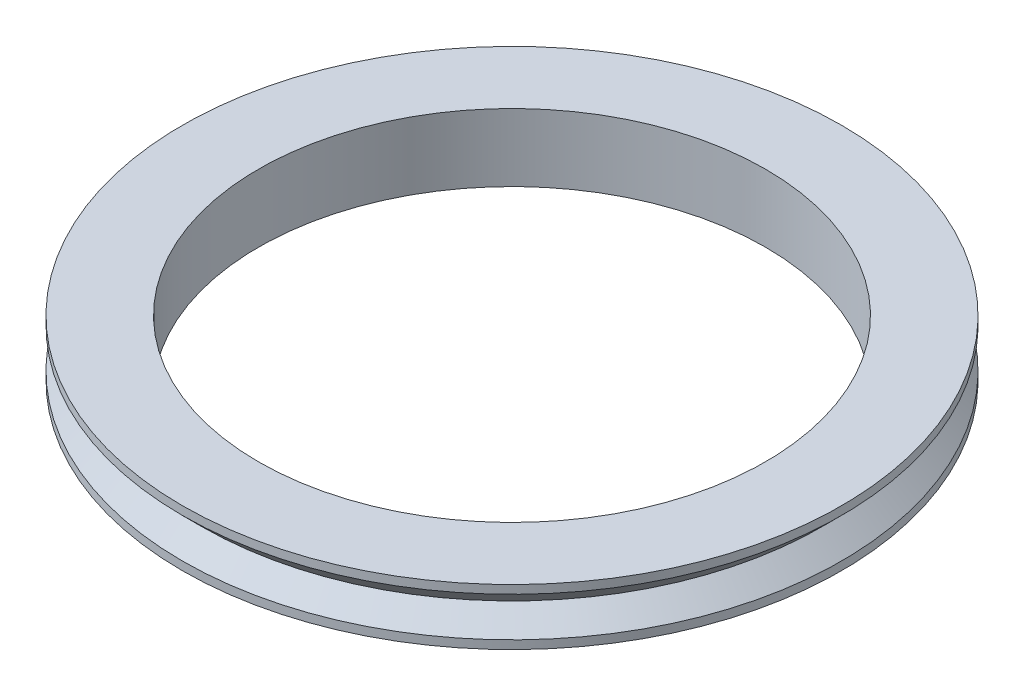
ISO-10303-21;
HEADER;
FILE_DESCRIPTION(('STEP AP214'),'2;1');
FILE_NAME('part.step','',(''),(''),'','','');
FILE_SCHEMA(('AUTOMOTIVE_DESIGN { 1 0 10303 214 1 1 1 1 }'));
ENDSEC;
DATA;
#1=APPLICATION_CONTEXT('core data for automotive mechanical design processes');
#2=APPLICATION_PROTOCOL_DEFINITION('international standard','automotive_design',2000,#1);
#3=PRODUCT_CONTEXT('',#1,'mechanical');
#4=PRODUCT('Part','Part','',(#3));
#5=PRODUCT_RELATED_PRODUCT_CATEGORY('part','',(#4));
#6=PRODUCT_DEFINITION_FORMATION('','',#4);
#7=PRODUCT_DEFINITION_CONTEXT('part definition',#1,'design');
#8=PRODUCT_DEFINITION('design','',#6,#7);
#9=PRODUCT_DEFINITION_SHAPE('','',#8);
#10=(LENGTH_UNIT() NAMED_UNIT(*) SI_UNIT(.MILLI.,.METRE.));
#11=(NAMED_UNIT(*) PLANE_ANGLE_UNIT() SI_UNIT($,.RADIAN.));
#12=(NAMED_UNIT(*) SI_UNIT($,.STERADIAN.) SOLID_ANGLE_UNIT());
#13=UNCERTAINTY_MEASURE_WITH_UNIT(LENGTH_MEASURE(1.E-05),#10,'distance_accuracy_value','');
#14=(GEOMETRIC_REPRESENTATION_CONTEXT(3) GLOBAL_UNCERTAINTY_ASSIGNED_CONTEXT((#13)) GLOBAL_UNIT_ASSIGNED_CONTEXT((#10,
#11,#12)) REPRESENTATION_CONTEXT('',''));
#15=CARTESIAN_POINT('',(0.,0.,0.));
#16=DIRECTION('',(0.,0.,1.));
#17=DIRECTION('',(1.,0.,0.));
#18=AXIS2_PLACEMENT_3D('',#15,#16,#17);
#19=CARTESIAN_POINT('',(0.,68.201523178808,0.));
#20=DIRECTION('',(0.,1.,0.));
#21=DIRECTION('',(0.,0.,1.));
#22=AXIS2_PLACEMENT_3D('',#19,#20,#21);
#23=CYLINDRICAL_SURFACE('',#22,22.5);
#24=CARTESIAN_POINT('',(0.,0.,0.));
#25=DIRECTION('',(0.,1.,0.));
#26=DIRECTION('',(0.,0.,1.));
#27=AXIS2_PLACEMENT_3D('',#24,#25,#26);
#28=CIRCLE('',#27,22.5);
#29=CARTESIAN_POINT('',(0.,0.,22.5));
#30=VERTEX_POINT('',#29);
#31=EDGE_CURVE('E10',#30,#30,#28,.T.);
#32=ORIENTED_EDGE('',*,*,#31,.F.);
#33=EDGE_LOOP('',(#32));
#34=FACE_BOUND('',#33,.T.);
#35=CARTESIAN_POINT('',(0.,6.00000000000001,0.));
#36=DIRECTION('',(0.,1.,0.));
#37=DIRECTION('',(0.,0.,1.));
#38=AXIS2_PLACEMENT_3D('',#35,#36,#37);
#39=CIRCLE('',#38,22.5);
#40=CARTESIAN_POINT('',(0.,6.00000000000001,22.5));
#41=VERTEX_POINT('',#40);
#42=EDGE_CURVE('E57',#41,#41,#39,.T.);
#43=ORIENTED_EDGE('',*,*,#42,.T.);
#44=EDGE_LOOP('',(#43));
#45=FACE_BOUND('',#44,.T.);
#46=ADVANCED_FACE('F26',(#34,#45),#23,.F.);
#47=CARTESIAN_POINT('',(22.5,0.,0.));
#48=DIRECTION('',(0.,1.,0.));
#49=DIRECTION('',(0.,0.,1.));
#50=AXIS2_PLACEMENT_3D('',#47,#48,#49);
#51=PLANE('',#50);
#52=CARTESIAN_POINT('',(0.,0.,0.));
#53=DIRECTION('',(0.,1.,0.));
#54=DIRECTION('',(0.,0.,1.));
#55=AXIS2_PLACEMENT_3D('',#52,#53,#54);
#56=CIRCLE('',#55,24.5);
#57=CARTESIAN_POINT('',(0.,0.,24.5));
#58=VERTEX_POINT('',#57);
#59=EDGE_CURVE('E32',#58,#58,#56,.T.);
#60=ORIENTED_EDGE('',*,*,#59,.F.);
#61=EDGE_LOOP('',(#60));
#62=FACE_BOUND('',#61,.T.);
#63=ORIENTED_EDGE('',*,*,#31,.T.);
#64=EDGE_LOOP('',(#63));
#65=FACE_BOUND('',#64,.T.);
#66=ADVANCED_FACE('F100',(#62,#65),#51,.F.);
#67=CARTESIAN_POINT('',(0.,68.201523178808,0.));
#68=DIRECTION('',(0.,1.,0.));
#69=DIRECTION('',(0.,0.,1.));
#70=AXIS2_PLACEMENT_3D('',#67,#68,#69);
#71=CYLINDRICAL_SURFACE('',#70,24.5);
#72=CARTESIAN_POINT('',(0.,1.,0.));
#73=DIRECTION('',(0.,1.,0.));
#74=DIRECTION('',(0.,0.,1.));
#75=AXIS2_PLACEMENT_3D('',#72,#73,#74);
#76=CIRCLE('',#75,24.5);
#77=CARTESIAN_POINT('',(0.,1.,24.5));
#78=VERTEX_POINT('',#77);
#79=EDGE_CURVE('E36',#78,#78,#76,.T.);
#80=ORIENTED_EDGE('',*,*,#79,.F.);
#81=EDGE_LOOP('',(#80));
#82=FACE_BOUND('',#81,.T.);
#83=ORIENTED_EDGE('',*,*,#59,.T.);
#84=EDGE_LOOP('',(#83));
#85=FACE_BOUND('',#84,.T.);
#86=ADVANCED_FACE('F95',(#82,#85),#71,.T.);
#87=CARTESIAN_POINT('',(24.5,1.,0.));
#88=DIRECTION('',(0.,1.,0.));
#89=DIRECTION('',(0.,0.,1.));
#90=AXIS2_PLACEMENT_3D('',#87,#88,#89);
#91=PLANE('',#90);
#92=CARTESIAN_POINT('',(0.,1.,0.));
#93=DIRECTION('',(0.,1.,0.));
#94=DIRECTION('',(0.,0.,1.));
#95=AXIS2_PLACEMENT_3D('',#92,#93,#94);
#96=CIRCLE('',#95,29.25);
#97=CARTESIAN_POINT('',(0.,1.,29.25));
#98=VERTEX_POINT('',#97);
#99=EDGE_CURVE('E40',#98,#98,#96,.T.);
#100=ORIENTED_EDGE('',*,*,#99,.F.);
#101=EDGE_LOOP('',(#100));
#102=FACE_BOUND('',#101,.T.);
#103=ORIENTED_EDGE('',*,*,#79,.T.);
#104=EDGE_LOOP('',(#103));
#105=FACE_BOUND('',#104,.T.);
#106=ADVANCED_FACE('F89',(#102,#105),#91,.F.);
#107=CARTESIAN_POINT('',(0.,68.201523178808,0.));
#108=DIRECTION('',(0.,1.,0.));
#109=DIRECTION('',(0.,0.,1.));
#110=AXIS2_PLACEMENT_3D('',#107,#108,#109);
#111=CYLINDRICAL_SURFACE('',#110,29.25);
#112=CARTESIAN_POINT('',(0.,1.75,0.));
#113=DIRECTION('',(0.,1.,0.));
#114=DIRECTION('',(0.,0.,1.));
#115=AXIS2_PLACEMENT_3D('',#112,#113,#114);
#116=CIRCLE('',#115,29.25);
#117=CARTESIAN_POINT('',(0.,1.75,29.25));
#118=VERTEX_POINT('',#117);
#119=EDGE_CURVE('E45',#118,#118,#116,.T.);
#120=ORIENTED_EDGE('',*,*,#119,.F.);
#121=EDGE_LOOP('',(#120));
#122=FACE_BOUND('',#121,.T.);
#123=ORIENTED_EDGE('',*,*,#99,.T.);
#124=EDGE_LOOP('',(#123));
#125=FACE_BOUND('',#124,.T.);
#126=ADVANCED_FACE('F83',(#122,#125),#111,.T.);
#127=CARTESIAN_POINT('',(0.,1.75,0.));
#128=DIRECTION('',(0.,-1.,0.));
#129=DIRECTION('',(0.,0.,-1.));
#130=AXIS2_PLACEMENT_3D('',#127,#128,#129);
#131=CONICAL_SURFACE('',#130,29.25,0.785398163397445);
#132=CARTESIAN_POINT('',(0.,3.5,0.));
#133=DIRECTION('',(0.,1.,0.));
#134=DIRECTION('',(0.,0.,1.));
#135=AXIS2_PLACEMENT_3D('',#132,#133,#134);
#136=CIRCLE('',#135,27.5);
#137=CARTESIAN_POINT('',(0.,3.5,27.5));
#138=VERTEX_POINT('',#137);
#139=EDGE_CURVE('E48',#138,#138,#136,.T.);
#140=ORIENTED_EDGE('',*,*,#139,.F.);
#141=EDGE_LOOP('',(#140));
#142=FACE_BOUND('',#141,.T.);
#143=ORIENTED_EDGE('',*,*,#119,.T.);
#144=EDGE_LOOP('',(#143));
#145=FACE_BOUND('',#144,.T.);
#146=ADVANCED_FACE('F77',(#142,#145),#131,.T.);
#147=CARTESIAN_POINT('',(0.,3.5,0.));
#148=DIRECTION('',(0.,1.,0.));
#149=DIRECTION('',(0.,0.,1.));
#150=AXIS2_PLACEMENT_3D('',#147,#148,#149);
#151=CONICAL_SURFACE('',#150,27.5,0.785398163397445);
#152=CARTESIAN_POINT('',(0.,5.25,0.));
#153=DIRECTION('',(0.,1.,0.));
#154=DIRECTION('',(0.,0.,1.));
#155=AXIS2_PLACEMENT_3D('',#152,#153,#154);
#156=CIRCLE('',#155,29.25);
#157=CARTESIAN_POINT('',(0.,5.25,29.25));
#158=VERTEX_POINT('',#157);
#159=EDGE_CURVE('E51',#158,#158,#156,.T.);
#160=ORIENTED_EDGE('',*,*,#159,.F.);
#161=EDGE_LOOP('',(#160));
#162=FACE_BOUND('',#161,.T.);
#163=ORIENTED_EDGE('',*,*,#139,.T.);
#164=EDGE_LOOP('',(#163));
#165=FACE_BOUND('',#164,.T.);
#166=ADVANCED_FACE('F71',(#162,#165),#151,.T.);
#167=CARTESIAN_POINT('',(0.,68.201523178808,0.));
#168=DIRECTION('',(0.,1.,0.));
#169=DIRECTION('',(0.,0.,1.));
#170=AXIS2_PLACEMENT_3D('',#167,#168,#169);
#171=CYLINDRICAL_SURFACE('',#170,29.25);
#172=CARTESIAN_POINT('',(0.,6.00000000000001,0.));
#173=DIRECTION('',(0.,1.,0.));
#174=DIRECTION('',(0.,0.,1.));
#175=AXIS2_PLACEMENT_3D('',#172,#173,#174);
#176=CIRCLE('',#175,29.25);
#177=CARTESIAN_POINT('',(0.,6.00000000000001,29.25));
#178=VERTEX_POINT('',#177);
#179=EDGE_CURVE('E54',#178,#178,#176,.T.);
#180=ORIENTED_EDGE('',*,*,#179,.F.);
#181=EDGE_LOOP('',(#180));
#182=FACE_BOUND('',#181,.T.);
#183=ORIENTED_EDGE('',*,*,#159,.T.);
#184=EDGE_LOOP('',(#183));
#185=FACE_BOUND('',#184,.T.);
#186=ADVANCED_FACE('F65',(#182,#185),#171,.T.);
#187=CARTESIAN_POINT('',(29.25,6.,0.));
#188=DIRECTION('',(0.,-1.,0.));
#189=DIRECTION('',(0.,0.,-1.));
#190=AXIS2_PLACEMENT_3D('',#187,#188,#189);
#191=PLANE('',#190);
#192=ORIENTED_EDGE('',*,*,#42,.F.);
#193=EDGE_LOOP('',(#192));
#194=FACE_BOUND('',#193,.T.);
#195=ORIENTED_EDGE('',*,*,#179,.T.);
#196=EDGE_LOOP('',(#195));
#197=FACE_BOUND('',#196,.T.);
#198=ADVANCED_FACE('F62',(#194,#197),#191,.F.);
#199=CLOSED_SHELL('',(#46,#66,#86,#106,#126,#146,#166,#186,#198));
#200=MANIFOLD_SOLID_BREP('B2',#199);
#201=ADVANCED_BREP_SHAPE_REPRESENTATION('',(#18,#200),#14);
#202=SHAPE_DEFINITION_REPRESENTATION(#9,#201);
ENDSEC;
END-ISO-10303-21;
